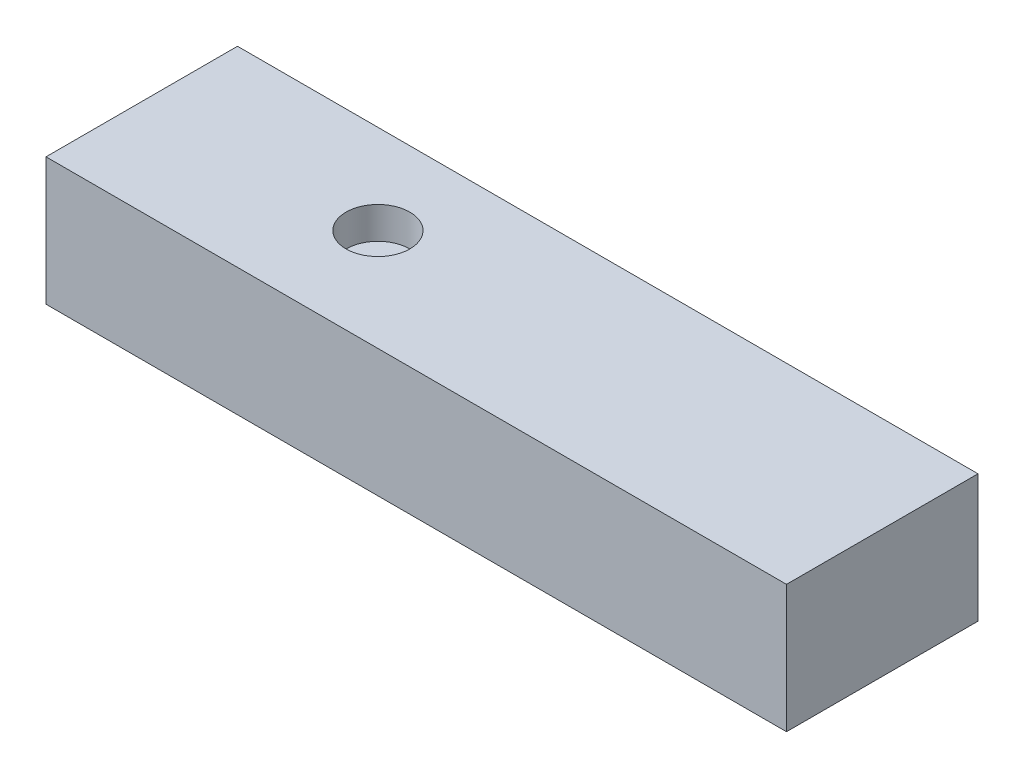
ISO-10303-21;
HEADER;
FILE_DESCRIPTION(('STEP AP214'),'2;1');
FILE_NAME('part.step','',(''),(''),'','','');
FILE_SCHEMA(('AUTOMOTIVE_DESIGN { 1 0 10303 214 1 1 1 1 }'));
ENDSEC;
DATA;
#1=APPLICATION_CONTEXT('core data for automotive mechanical design processes');
#2=APPLICATION_PROTOCOL_DEFINITION('international standard','automotive_design',2000,#1);
#3=PRODUCT_CONTEXT('',#1,'mechanical');
#4=PRODUCT('Part','Part','',(#3));
#5=PRODUCT_RELATED_PRODUCT_CATEGORY('part','',(#4));
#6=PRODUCT_DEFINITION_FORMATION('','',#4);
#7=PRODUCT_DEFINITION_CONTEXT('part definition',#1,'design');
#8=PRODUCT_DEFINITION('design','',#6,#7);
#9=PRODUCT_DEFINITION_SHAPE('','',#8);
#10=(LENGTH_UNIT() NAMED_UNIT(*) SI_UNIT(.MILLI.,.METRE.));
#11=(NAMED_UNIT(*) PLANE_ANGLE_UNIT() SI_UNIT($,.RADIAN.));
#12=(NAMED_UNIT(*) SI_UNIT($,.STERADIAN.) SOLID_ANGLE_UNIT());
#13=UNCERTAINTY_MEASURE_WITH_UNIT(LENGTH_MEASURE(1.E-05),#10,'distance_accuracy_value','');
#14=(GEOMETRIC_REPRESENTATION_CONTEXT(3) GLOBAL_UNCERTAINTY_ASSIGNED_CONTEXT((#13)) GLOBAL_UNIT_ASSIGNED_CONTEXT((#10,
#11,#12)) REPRESENTATION_CONTEXT('',''));
#15=CARTESIAN_POINT('',(0.,0.,0.));
#16=DIRECTION('',(0.,0.,1.));
#17=DIRECTION('',(1.,0.,0.));
#18=AXIS2_PLACEMENT_3D('',#15,#16,#17);
#19=CARTESIAN_POINT('',(57.8755281431337,137.441599193414,57.9247637036188));
#20=DIRECTION('',(0.,1.,0.));
#21=DIRECTION('',(1.,0.,0.));
#22=AXIS2_PLACEMENT_3D('',#19,#20,#21);
#23=CYLINDRICAL_SURFACE('',#22,0.634999999999894);
#24=CARTESIAN_POINT('',(57.8755281431337,139.237650417627,57.9247637036188));
#25=DIRECTION('',(0.,-1.,0.));
#26=DIRECTION('',(1.,0.,0.));
#27=AXIS2_PLACEMENT_3D('',#24,#25,#26);
#28=CIRCLE('',#27,0.634999999999894);
#29=CARTESIAN_POINT('',(58.5105281431336,139.237650417627,57.9247637036188));
#30=VERTEX_POINT('',#29);
#31=EDGE_CURVE('E121',#30,#30,#28,.F.);
#32=ORIENTED_EDGE('',*,*,#31,.F.);
#33=EDGE_LOOP('',(#32));
#34=FACE_BOUND('',#33,.T.);
#35=CARTESIAN_POINT('',(57.8755281431337,142.412650417627,57.9247637036188));
#36=DIRECTION('',(0.,-1.,0.));
#37=DIRECTION('',(1.,0.,0.));
#38=AXIS2_PLACEMENT_3D('',#35,#36,#37);
#39=CIRCLE('',#38,0.634999999999894);
#40=CARTESIAN_POINT('',(58.5105281431336,142.412650417627,57.9247637036188));
#41=VERTEX_POINT('',#40);
#42=EDGE_CURVE('E41',#41,#41,#39,.F.);
#43=ORIENTED_EDGE('',*,*,#42,.T.);
#44=EDGE_LOOP('',(#43));
#45=FACE_BOUND('',#44,.T.);
#46=ADVANCED_FACE('F37',(#34,#45),#23,.F.);
#47=CARTESIAN_POINT('',(35.0155281431337,132.887650417627,49.0347637036188));
#48=DIRECTION('',(-1.,0.,0.));
#49=DIRECTION('',(0.,1.,0.));
#50=AXIS2_PLACEMENT_3D('',#47,#48,#49);
#51=PLANE('',#50);
#52=DIRECTION('',(0.,1.,0.));
#53=VECTOR('',#52,1.);
#54=CARTESIAN_POINT('',(35.0155281431337,132.887650417627,49.0347637036188));
#55=LINE('',#54,#53);
#56=CARTESIAN_POINT('',(35.0155281431337,132.887650417627,49.0347637036188));
#57=VERTEX_POINT('',#56);
#58=CARTESIAN_POINT('',(35.0155281431337,145.587650417627,49.0347637036188));
#59=VERTEX_POINT('',#58);
#60=EDGE_CURVE('E131',#57,#59,#55,.T.);
#61=ORIENTED_EDGE('',*,*,#60,.F.);
#62=DIRECTION('',(0.,0.,-1.));
#63=VECTOR('',#62,1.);
#64=CARTESIAN_POINT('',(35.0155281431337,132.887650417627,49.0347637036188));
#65=LINE('',#64,#63);
#66=CARTESIAN_POINT('',(35.0155281431337,132.887650417627,68.0847637036188));
#67=VERTEX_POINT('',#66);
#68=EDGE_CURVE('E130',#67,#57,#65,.T.);
#69=ORIENTED_EDGE('',*,*,#68,.F.);
#70=DIRECTION('',(0.,1.,0.));
#71=VECTOR('',#70,1.);
#72=CARTESIAN_POINT('',(35.0155281431337,132.887650417627,68.0847637036188));
#73=LINE('',#72,#71);
#74=CARTESIAN_POINT('',(35.0155281431337,145.587650417627,68.0847637036188));
#75=VERTEX_POINT('',#74);
#76=EDGE_CURVE('E11',#67,#75,#73,.T.);
#77=ORIENTED_EDGE('',*,*,#76,.T.);
#78=DIRECTION('',(0.,0.,-1.));
#79=VECTOR('',#78,1.);
#80=CARTESIAN_POINT('',(35.0155281431337,145.587650417627,68.0847637036188));
#81=LINE('',#80,#79);
#82=EDGE_CURVE('E120',#75,#59,#81,.T.);
#83=ORIENTED_EDGE('',*,*,#82,.T.);
#84=EDGE_LOOP('',(#61,#69,#77,#83));
#85=FACE_BOUND('',#84,.T.);
#86=ADVANCED_FACE('F39',(#85),#51,.T.);
#87=CARTESIAN_POINT('',(108.675528143134,132.887650417628,68.0847637036188));
#88=DIRECTION('',(0.,0.,1.));
#89=DIRECTION('',(0.,-1.,0.));
#90=AXIS2_PLACEMENT_3D('',#87,#88,#89);
#91=PLANE('',#90);
#92=ORIENTED_EDGE('',*,*,#76,.F.);
#93=DIRECTION('',(-1.,0.,0.));
#94=VECTOR('',#93,1.);
#95=CARTESIAN_POINT('',(108.675528143134,132.887650417628,68.0847637036188));
#96=LINE('',#95,#94);
#97=CARTESIAN_POINT('',(108.675528143134,132.887650417628,68.0847637036188));
#98=VERTEX_POINT('',#97);
#99=EDGE_CURVE('E62',#98,#67,#96,.T.);
#100=ORIENTED_EDGE('',*,*,#99,.F.);
#101=DIRECTION('',(0.,1.,0.));
#102=VECTOR('',#101,1.);
#103=CARTESIAN_POINT('',(108.675528143134,132.887650417628,68.0847637036188));
#104=LINE('',#103,#102);
#105=CARTESIAN_POINT('',(108.675528143134,145.587650417628,68.0847637036188));
#106=VERTEX_POINT('',#105);
#107=EDGE_CURVE('E46',#98,#106,#104,.T.);
#108=ORIENTED_EDGE('',*,*,#107,.T.);
#109=DIRECTION('',(-1.,0.,0.));
#110=VECTOR('',#109,1.);
#111=CARTESIAN_POINT('',(108.675528143134,145.587650417628,68.0847637036188));
#112=LINE('',#111,#110);
#113=EDGE_CURVE('E113',#106,#75,#112,.T.);
#114=ORIENTED_EDGE('',*,*,#113,.T.);
#115=EDGE_LOOP('',(#92,#100,#108,#114));
#116=FACE_BOUND('',#115,.T.);
#117=ADVANCED_FACE('F115',(#116),#91,.T.);
#118=CARTESIAN_POINT('',(108.675528143134,132.887650417628,49.0347637036188));
#119=DIRECTION('',(1.,0.,0.));
#120=DIRECTION('',(0.,-1.,0.));
#121=AXIS2_PLACEMENT_3D('',#118,#119,#120);
#122=PLANE('',#121);
#123=ORIENTED_EDGE('',*,*,#107,.F.);
#124=DIRECTION('',(0.,0.,1.));
#125=VECTOR('',#124,1.);
#126=CARTESIAN_POINT('',(108.675528143134,132.887650417628,49.0347637036188));
#127=LINE('',#126,#125);
#128=CARTESIAN_POINT('',(108.675528143134,132.887650417628,49.0347637036188));
#129=VERTEX_POINT('',#128);
#130=EDGE_CURVE('E135',#129,#98,#127,.T.);
#131=ORIENTED_EDGE('',*,*,#130,.F.);
#132=DIRECTION('',(0.,1.,0.));
#133=VECTOR('',#132,1.);
#134=CARTESIAN_POINT('',(108.675528143134,132.887650417628,49.0347637036188));
#135=LINE('',#134,#133);
#136=CARTESIAN_POINT('',(108.675528143134,145.587650417628,49.0347637036188));
#137=VERTEX_POINT('',#136);
#138=EDGE_CURVE('E147',#129,#137,#135,.T.);
#139=ORIENTED_EDGE('',*,*,#138,.T.);
#140=DIRECTION('',(0.,0.,1.));
#141=VECTOR('',#140,1.);
#142=CARTESIAN_POINT('',(108.675528143134,145.587650417628,49.0347637036188));
#143=LINE('',#142,#141);
#144=EDGE_CURVE('E156',#137,#106,#143,.T.);
#145=ORIENTED_EDGE('',*,*,#144,.T.);
#146=EDGE_LOOP('',(#123,#131,#139,#145));
#147=FACE_BOUND('',#146,.T.);
#148=ADVANCED_FACE('F155',(#147),#122,.T.);
#149=CARTESIAN_POINT('',(108.675528143134,132.887650417628,49.0347637036188));
#150=DIRECTION('',(0.,0.,-1.));
#151=DIRECTION('',(0.,1.,0.));
#152=AXIS2_PLACEMENT_3D('',#149,#150,#151);
#153=PLANE('',#152);
#154=ORIENTED_EDGE('',*,*,#138,.F.);
#155=DIRECTION('',(1.,0.,0.));
#156=VECTOR('',#155,1.);
#157=CARTESIAN_POINT('',(108.675528143134,132.887650417628,49.0347637036188));
#158=LINE('',#157,#156);
#159=EDGE_CURVE('E132',#57,#129,#158,.T.);
#160=ORIENTED_EDGE('',*,*,#159,.F.);
#161=ORIENTED_EDGE('',*,*,#60,.T.);
#162=DIRECTION('',(1.,0.,0.));
#163=VECTOR('',#162,1.);
#164=CARTESIAN_POINT('',(35.0155281431337,145.587650417627,49.0347637036188));
#165=LINE('',#164,#163);
#166=EDGE_CURVE('E125',#59,#137,#165,.T.);
#167=ORIENTED_EDGE('',*,*,#166,.T.);
#168=EDGE_LOOP('',(#154,#160,#161,#167));
#169=FACE_BOUND('',#168,.T.);
#170=ADVANCED_FACE('F151',(#169),#153,.T.);
#171=CARTESIAN_POINT('',(70.0310562862672,132.887650417627,0.));
#172=DIRECTION('',(0.,1.,0.));
#173=DIRECTION('',(1.,0.,0.));
#174=AXIS2_PLACEMENT_3D('',#171,#172,#173);
#175=PLANE('',#174);
#176=DIRECTION('',(-0.999981681253047,0.,-0.00605286364701991));
#177=VECTOR('',#176,1.);
#178=CARTESIAN_POINT('',(69.3462014227508,132.887650417627,59.6325254089744));
#179=LINE('',#178,#177);
#180=CARTESIAN_POINT('',(69.3462014227508,132.887650417627,59.6325254089744));
#181=VERTEX_POINT('',#180);
#182=CARTESIAN_POINT('',(60.0895310168965,132.887650417627,59.5764950187758));
#183=VERTEX_POINT('',#182);
#184=EDGE_CURVE('E175',#181,#183,#179,.T.);
#185=ORIENTED_EDGE('',*,*,#184,.F.);
#186=CARTESIAN_POINT('',(69.356194700632,132.887650417627,57.9815556532256));
#187=DIRECTION('',(0.,-1.,0.));
#188=DIRECTION('',(1.,0.,0.));
#189=AXIS2_PLACEMENT_3D('',#186,#187,#188);
#190=CIRCLE('',#189,1.651);
#191=CARTESIAN_POINT('',(71.0070387390308,132.887650417627,58.0042484027954));
#192=VERTEX_POINT('',#191);
#193=EDGE_CURVE('E172',#192,#181,#190,.T.);
#194=ORIENTED_EDGE('',*,*,#193,.F.);
#195=CARTESIAN_POINT('',(69.3560409578954,132.887650417627,58.0069551879294));
#196=DIRECTION('',(0.,-1.,0.));
#197=DIRECTION('',(1.,0.,0.));
#198=AXIS2_PLACEMENT_3D('',#195,#196,#197);
#199=CIRCLE('',#198,1.651);
#200=CARTESIAN_POINT('',(69.3660342357766,132.887650417627,56.3559854321807));
#201=VERTEX_POINT('',#200);
#202=EDGE_CURVE('E170',#201,#192,#199,.T.);
#203=ORIENTED_EDGE('',*,*,#202,.F.);
#204=DIRECTION('',(0.999981681253047,0.,0.00605286364702066));
#205=VECTOR('',#204,1.);
#206=CARTESIAN_POINT('',(60.1093638299223,132.887650417627,56.2999550419821));
#207=LINE('',#206,#205);
#208=CARTESIAN_POINT('',(60.1093638299223,132.887650417627,56.2999550419821));
#209=VERTEX_POINT('',#208);
#210=EDGE_CURVE('E167',#209,#201,#207,.T.);
#211=ORIENTED_EDGE('',*,*,#210,.F.);
#212=CARTESIAN_POINT('',(57.8755281431337,132.887650417627,57.9247637036188));
#213=DIRECTION('',(0.,-1.,0.));
#214=DIRECTION('',(1.,0.,0.));
#215=AXIS2_PLACEMENT_3D('',#212,#213,#214);
#216=CIRCLE('',#215,2.76225);
#217=EDGE_CURVE('E164',#183,#209,#216,.T.);
#218=ORIENTED_EDGE('',*,*,#217,.F.);
#219=EDGE_LOOP('',(#185,#194,#203,#211,#218));
#220=FACE_BOUND('',#219,.T.);
#221=ORIENTED_EDGE('',*,*,#68,.T.);
#222=ORIENTED_EDGE('',*,*,#159,.T.);
#223=ORIENTED_EDGE('',*,*,#130,.T.);
#224=ORIENTED_EDGE('',*,*,#99,.T.);
#225=EDGE_LOOP('',(#221,#222,#223,#224));
#226=FACE_BOUND('',#225,.T.);
#227=ADVANCED_FACE('F153',(#220,#226),#175,.F.);
#228=CARTESIAN_POINT('',(57.8755281431337,132.887650417627,57.9247637036188));
#229=DIRECTION('',(0.,1.,0.));
#230=DIRECTION('',(1.,0.,0.));
#231=AXIS2_PLACEMENT_3D('',#228,#229,#230);
#232=CYLINDRICAL_SURFACE('',#231,2.76225);
#233=CARTESIAN_POINT('',(57.8755281431337,139.237650417627,57.9247637036188));
#234=DIRECTION('',(0.,-1.,0.));
#235=DIRECTION('',(1.,0.,0.));
#236=AXIS2_PLACEMENT_3D('',#233,#234,#235);
#237=CIRCLE('',#236,2.76225);
#238=CARTESIAN_POINT('',(60.0895310168965,139.237650417627,59.5764950187758));
#239=VERTEX_POINT('',#238);
#240=CARTESIAN_POINT('',(60.1093638299223,139.237650417627,56.2999550419821));
#241=VERTEX_POINT('',#240);
#242=EDGE_CURVE('E157',#239,#241,#237,.T.);
#243=ORIENTED_EDGE('',*,*,#242,.F.);
#244=DIRECTION('',(0.,1.,0.));
#245=VECTOR('',#244,1.);
#246=CARTESIAN_POINT('',(60.0895310168965,132.887650417627,59.5764950187758));
#247=LINE('',#246,#245);
#248=EDGE_CURVE('E133',#183,#239,#247,.T.);
#249=ORIENTED_EDGE('',*,*,#248,.F.);
#250=ORIENTED_EDGE('',*,*,#217,.T.);
#251=DIRECTION('',(0.,1.,0.));
#252=VECTOR('',#251,1.);
#253=CARTESIAN_POINT('',(60.1093638299223,132.887650417627,56.2999550419821));
#254=LINE('',#253,#252);
#255=EDGE_CURVE('E141',#209,#241,#254,.T.);
#256=ORIENTED_EDGE('',*,*,#255,.T.);
#257=EDGE_LOOP('',(#243,#249,#250,#256));
#258=FACE_BOUND('',#257,.T.);
#259=ADVANCED_FACE('F192',(#258),#232,.F.);
#260=CARTESIAN_POINT('',(69.3462014227508,132.887650417627,59.6325254089744));
#261=DIRECTION('',(-0.00605286364701991,0.,0.999981681253047));
#262=DIRECTION('',(-0.999981681253047,0.,-0.00605286364701992));
#263=AXIS2_PLACEMENT_3D('',#260,#261,#262);
#264=PLANE('',#263);
#265=DIRECTION('',(-0.999981681253047,0.,-0.00605286364701991));
#266=VECTOR('',#265,1.);
#267=CARTESIAN_POINT('',(69.3462014227508,139.237650417627,59.6325254089744));
#268=LINE('',#267,#266);
#269=CARTESIAN_POINT('',(69.3462014227508,139.237650417627,59.6325254089744));
#270=VERTEX_POINT('',#269);
#271=EDGE_CURVE('E168',#270,#239,#268,.T.);
#272=ORIENTED_EDGE('',*,*,#271,.F.);
#273=DIRECTION('',(0.,1.,0.));
#274=VECTOR('',#273,1.);
#275=CARTESIAN_POINT('',(69.3462014227508,132.887650417627,59.6325254089744));
#276=LINE('',#275,#274);
#277=EDGE_CURVE('E138',#181,#270,#276,.T.);
#278=ORIENTED_EDGE('',*,*,#277,.F.);
#279=ORIENTED_EDGE('',*,*,#184,.T.);
#280=ORIENTED_EDGE('',*,*,#248,.T.);
#281=EDGE_LOOP('',(#272,#278,#279,#280));
#282=FACE_BOUND('',#281,.T.);
#283=ADVANCED_FACE('F200',(#282),#264,.F.);
#284=CARTESIAN_POINT('',(69.356194700632,132.887650417627,57.9815556532256));
#285=DIRECTION('',(0.,1.,0.));
#286=DIRECTION('',(1.,0.,0.));
#287=AXIS2_PLACEMENT_3D('',#284,#285,#286);
#288=CYLINDRICAL_SURFACE('',#287,1.651);
#289=CARTESIAN_POINT('',(69.356194700632,139.237650417627,57.9815556532256));
#290=DIRECTION('',(0.,-1.,0.));
#291=DIRECTION('',(1.,0.,0.));
#292=AXIS2_PLACEMENT_3D('',#289,#290,#291);
#293=CIRCLE('',#292,1.651);
#294=CARTESIAN_POINT('',(71.0070387390308,139.237650417627,58.0042484027954));
#295=VERTEX_POINT('',#294);
#296=EDGE_CURVE('E181',#295,#270,#293,.T.);
#297=ORIENTED_EDGE('',*,*,#296,.F.);
#298=DIRECTION('',(0.,1.,0.));
#299=VECTOR('',#298,1.);
#300=CARTESIAN_POINT('',(71.0070387390308,132.887650417627,58.0042484027954));
#301=LINE('',#300,#299);
#302=EDGE_CURVE('E186',#192,#295,#301,.T.);
#303=ORIENTED_EDGE('',*,*,#302,.F.);
#304=ORIENTED_EDGE('',*,*,#193,.T.);
#305=ORIENTED_EDGE('',*,*,#277,.T.);
#306=EDGE_LOOP('',(#297,#303,#304,#305));
#307=FACE_BOUND('',#306,.T.);
#308=ADVANCED_FACE('F215',(#307),#288,.F.);
#309=CARTESIAN_POINT('',(69.3560409578954,132.887650417627,58.0069551879294));
#310=DIRECTION('',(0.,1.,0.));
#311=DIRECTION('',(1.,0.,0.));
#312=AXIS2_PLACEMENT_3D('',#309,#310,#311);
#313=CYLINDRICAL_SURFACE('',#312,1.651);
#314=CARTESIAN_POINT('',(69.3560409578954,139.237650417627,58.0069551879294));
#315=DIRECTION('',(0.,-1.,0.));
#316=DIRECTION('',(1.,0.,0.));
#317=AXIS2_PLACEMENT_3D('',#314,#315,#316);
#318=CIRCLE('',#317,1.651);
#319=CARTESIAN_POINT('',(69.3660342357766,139.237650417627,56.3559854321807));
#320=VERTEX_POINT('',#319);
#321=EDGE_CURVE('E179',#320,#295,#318,.T.);
#322=ORIENTED_EDGE('',*,*,#321,.F.);
#323=DIRECTION('',(0.,1.,0.));
#324=VECTOR('',#323,1.);
#325=CARTESIAN_POINT('',(69.3660342357766,132.887650417627,56.3559854321807));
#326=LINE('',#325,#324);
#327=EDGE_CURVE('E54',#201,#320,#326,.T.);
#328=ORIENTED_EDGE('',*,*,#327,.F.);
#329=ORIENTED_EDGE('',*,*,#202,.T.);
#330=ORIENTED_EDGE('',*,*,#302,.T.);
#331=EDGE_LOOP('',(#322,#328,#329,#330));
#332=FACE_BOUND('',#331,.T.);
#333=ADVANCED_FACE('F207',(#332),#313,.F.);
#334=CARTESIAN_POINT('',(60.1093638299223,132.887650417627,56.2999550419821));
#335=DIRECTION('',(0.00605286364702066,0.,-0.999981681253047));
#336=DIRECTION('',(0.999981681253047,0.,0.00605286364702066));
#337=AXIS2_PLACEMENT_3D('',#334,#335,#336);
#338=PLANE('',#337);
#339=DIRECTION('',(0.999981681253047,0.,0.00605286364702066));
#340=VECTOR('',#339,1.);
#341=CARTESIAN_POINT('',(60.1093638299223,139.237650417627,56.2999550419821));
#342=LINE('',#341,#340);
#343=EDGE_CURVE('E160',#241,#320,#342,.T.);
#344=ORIENTED_EDGE('',*,*,#343,.F.);
#345=ORIENTED_EDGE('',*,*,#255,.F.);
#346=ORIENTED_EDGE('',*,*,#210,.T.);
#347=ORIENTED_EDGE('',*,*,#327,.T.);
#348=EDGE_LOOP('',(#344,#345,#346,#347));
#349=FACE_BOUND('',#348,.T.);
#350=ADVANCED_FACE('F205',(#349),#338,.F.);
#351=CARTESIAN_POINT('',(70.0310562862672,139.237650417627,0.));
#352=DIRECTION('',(0.,1.,0.));
#353=DIRECTION('',(1.,0.,0.));
#354=AXIS2_PLACEMENT_3D('',#351,#352,#353);
#355=PLANE('',#354);
#356=ORIENTED_EDGE('',*,*,#31,.T.);
#357=EDGE_LOOP('',(#356));
#358=FACE_BOUND('',#357,.T.);
#359=ORIENTED_EDGE('',*,*,#343,.T.);
#360=ORIENTED_EDGE('',*,*,#321,.T.);
#361=ORIENTED_EDGE('',*,*,#296,.T.);
#362=ORIENTED_EDGE('',*,*,#271,.T.);
#363=ORIENTED_EDGE('',*,*,#242,.T.);
#364=EDGE_LOOP('',(#359,#360,#361,#362,#363));
#365=FACE_BOUND('',#364,.T.);
#366=ADVANCED_FACE('F196',(#358,#365),#355,.F.);
#367=CARTESIAN_POINT('',(70.0310562862672,145.587650417627,0.));
#368=DIRECTION('',(0.,1.,0.));
#369=DIRECTION('',(1.,0.,0.));
#370=AXIS2_PLACEMENT_3D('',#367,#368,#369);
#371=PLANE('',#370);
#372=CARTESIAN_POINT('',(57.8755281431338,145.587650417627,57.9247637036189));
#373=DIRECTION('',(0.,-1.,0.));
#374=DIRECTION('',(1.,0.,0.));
#375=AXIS2_PLACEMENT_3D('',#372,#373,#374);
#376=CIRCLE('',#375,3.175);
#377=CARTESIAN_POINT('',(61.0505281431338,145.587650417627,57.9247637036189));
#378=VERTEX_POINT('',#377);
#379=EDGE_CURVE('E289',#378,#378,#376,.T.);
#380=ORIENTED_EDGE('',*,*,#379,.T.);
#381=EDGE_LOOP('',(#380));
#382=FACE_BOUND('',#381,.T.);
#383=ORIENTED_EDGE('',*,*,#113,.F.);
#384=ORIENTED_EDGE('',*,*,#144,.F.);
#385=ORIENTED_EDGE('',*,*,#166,.F.);
#386=ORIENTED_EDGE('',*,*,#82,.F.);
#387=EDGE_LOOP('',(#383,#384,#385,#386));
#388=FACE_BOUND('',#387,.T.);
#389=ADVANCED_FACE('F124',(#382,#388),#371,.T.);
#390=CARTESIAN_POINT('',(57.8755281431338,142.412650417627,57.9247637036189));
#391=DIRECTION('',(0.,1.,0.));
#392=DIRECTION('',(1.,0.,0.));
#393=AXIS2_PLACEMENT_3D('',#390,#391,#392);
#394=PLANE('',#393);
#395=CARTESIAN_POINT('',(57.8755281431338,142.412650417627,57.9247637036189));
#396=DIRECTION('',(0.,-1.,0.));
#397=DIRECTION('',(1.,0.,0.));
#398=AXIS2_PLACEMENT_3D('',#395,#396,#397);
#399=CIRCLE('',#398,3.175);
#400=CARTESIAN_POINT('',(61.0505281431338,142.412650417627,57.9247637036189));
#401=VERTEX_POINT('',#400);
#402=EDGE_CURVE('E286',#401,#401,#399,.T.);
#403=ORIENTED_EDGE('',*,*,#402,.F.);
#404=EDGE_LOOP('',(#403));
#405=FACE_BOUND('',#404,.T.);
#406=ORIENTED_EDGE('',*,*,#42,.F.);
#407=EDGE_LOOP('',(#406));
#408=FACE_BOUND('',#407,.T.);
#409=ADVANCED_FACE('F231',(#405,#408),#394,.T.);
#410=CARTESIAN_POINT('',(57.8755281431338,142.412650417627,57.9247637036189));
#411=DIRECTION('',(0.,1.,0.));
#412=DIRECTION('',(1.,0.,0.));
#413=AXIS2_PLACEMENT_3D('',#410,#411,#412);
#414=CYLINDRICAL_SURFACE('',#413,3.175);
#415=ORIENTED_EDGE('',*,*,#402,.T.);
#416=EDGE_LOOP('',(#415));
#417=FACE_BOUND('',#416,.T.);
#418=ORIENTED_EDGE('',*,*,#379,.F.);
#419=EDGE_LOOP('',(#418));
#420=FACE_BOUND('',#419,.T.);
#421=ADVANCED_FACE('F228',(#417,#420),#414,.F.);
#422=CLOSED_SHELL('',(#46,#86,#117,#148,#170,#227,#259,#283,#308,#333,#350,#366,#389,#409,#421));
#423=MANIFOLD_SOLID_BREP('B2',#422);
#424=ADVANCED_BREP_SHAPE_REPRESENTATION('',(#18,#423),#14);
#425=SHAPE_DEFINITION_REPRESENTATION(#9,#424);
ENDSEC;
END-ISO-10303-21;
